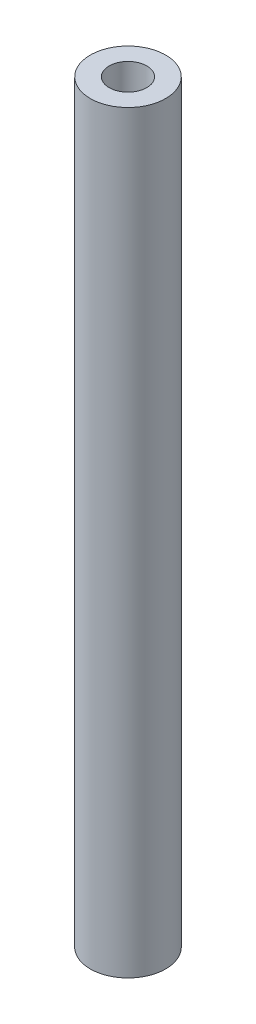
ISO-10303-21;
HEADER;
FILE_DESCRIPTION(('STEP AP214'),'2;1');
FILE_NAME('part.step','',(''),(''),'','','');
FILE_SCHEMA(('AUTOMOTIVE_DESIGN { 1 0 10303 214 1 1 1 1 }'));
ENDSEC;
DATA;
#1=APPLICATION_CONTEXT('core data for automotive mechanical design processes');
#2=APPLICATION_PROTOCOL_DEFINITION('international standard','automotive_design',2000,#1);
#3=PRODUCT_CONTEXT('',#1,'mechanical');
#4=PRODUCT('Part','Part','',(#3));
#5=PRODUCT_RELATED_PRODUCT_CATEGORY('part','',(#4));
#6=PRODUCT_DEFINITION_FORMATION('','',#4);
#7=PRODUCT_DEFINITION_CONTEXT('part definition',#1,'design');
#8=PRODUCT_DEFINITION('design','',#6,#7);
#9=PRODUCT_DEFINITION_SHAPE('','',#8);
#10=(LENGTH_UNIT() NAMED_UNIT(*) SI_UNIT(.MILLI.,.METRE.));
#11=(NAMED_UNIT(*) PLANE_ANGLE_UNIT() SI_UNIT($,.RADIAN.));
#12=(NAMED_UNIT(*) SI_UNIT($,.STERADIAN.) SOLID_ANGLE_UNIT());
#13=UNCERTAINTY_MEASURE_WITH_UNIT(LENGTH_MEASURE(1.E-05),#10,'distance_accuracy_value','');
#14=(GEOMETRIC_REPRESENTATION_CONTEXT(3) GLOBAL_UNCERTAINTY_ASSIGNED_CONTEXT((#13)) GLOBAL_UNIT_ASSIGNED_CONTEXT((#10,
#11,#12)) REPRESENTATION_CONTEXT('',''));
#15=CARTESIAN_POINT('',(0.,0.,0.));
#16=DIRECTION('',(0.,0.,1.));
#17=DIRECTION('',(1.,0.,0.));
#18=AXIS2_PLACEMENT_3D('',#15,#16,#17);
#19=CARTESIAN_POINT('',(0.,80.,0.));
#20=DIRECTION('',(0.,1.,0.));
#21=DIRECTION('',(0.,0.,1.));
#22=AXIS2_PLACEMENT_3D('',#19,#20,#21);
#23=PLANE('',#22);
#24=CARTESIAN_POINT('',(0.,80.,0.));
#25=DIRECTION('',(0.,1.,0.));
#26=DIRECTION('',(0.,0.,1.));
#27=AXIS2_PLACEMENT_3D('',#24,#25,#26);
#28=CIRCLE('',#27,4.);
#29=CARTESIAN_POINT('',(0.,80.,4.));
#30=VERTEX_POINT('',#29);
#31=EDGE_CURVE('E10',#30,#30,#28,.T.);
#32=ORIENTED_EDGE('',*,*,#31,.T.);
#33=EDGE_LOOP('',(#32));
#34=FACE_BOUND('',#33,.T.);
#35=CARTESIAN_POINT('',(0.,80.,0.));
#36=DIRECTION('',(0.,1.,0.));
#37=DIRECTION('',(0.,0.,1.));
#38=AXIS2_PLACEMENT_3D('',#35,#36,#37);
#39=CIRCLE('',#38,2.);
#40=CARTESIAN_POINT('',(0.,80.,2.));
#41=VERTEX_POINT('',#40);
#42=EDGE_CURVE('E48',#41,#41,#39,.T.);
#43=ORIENTED_EDGE('',*,*,#42,.F.);
#44=EDGE_LOOP('',(#43));
#45=FACE_BOUND('',#44,.T.);
#46=ADVANCED_FACE('F37',(#34,#45),#23,.T.);
#47=CARTESIAN_POINT('',(0.,0.,0.));
#48=DIRECTION('',(0.,1.,0.));
#49=DIRECTION('',(0.,0.,1.));
#50=AXIS2_PLACEMENT_3D('',#47,#48,#49);
#51=PLANE('',#50);
#52=CARTESIAN_POINT('',(0.,0.,0.));
#53=DIRECTION('',(0.,1.,0.));
#54=DIRECTION('',(0.,0.,1.));
#55=AXIS2_PLACEMENT_3D('',#52,#53,#54);
#56=CIRCLE('',#55,4.);
#57=CARTESIAN_POINT('',(0.,0.,4.));
#58=VERTEX_POINT('',#57);
#59=EDGE_CURVE('E41',#58,#58,#56,.T.);
#60=ORIENTED_EDGE('',*,*,#59,.F.);
#61=EDGE_LOOP('',(#60));
#62=FACE_BOUND('',#61,.T.);
#63=CARTESIAN_POINT('',(0.,0.,0.));
#64=DIRECTION('',(0.,1.,0.));
#65=DIRECTION('',(0.,0.,1.));
#66=AXIS2_PLACEMENT_3D('',#63,#64,#65);
#67=CIRCLE('',#66,2.);
#68=CARTESIAN_POINT('',(0.,0.,2.));
#69=VERTEX_POINT('',#68);
#70=EDGE_CURVE('E50',#69,#69,#67,.T.);
#71=ORIENTED_EDGE('',*,*,#70,.T.);
#72=EDGE_LOOP('',(#71));
#73=FACE_BOUND('',#72,.T.);
#74=ADVANCED_FACE('F60',(#62,#73),#51,.F.);
#75=CARTESIAN_POINT('',(0.,80.,0.));
#76=DIRECTION('',(0.,-1.,0.));
#77=DIRECTION('',(0.,0.,-1.));
#78=AXIS2_PLACEMENT_3D('',#75,#76,#77);
#79=CYLINDRICAL_SURFACE('',#78,4.);
#80=ORIENTED_EDGE('',*,*,#31,.F.);
#81=EDGE_LOOP('',(#80));
#82=FACE_BOUND('',#81,.T.);
#83=ORIENTED_EDGE('',*,*,#59,.T.);
#84=EDGE_LOOP('',(#83));
#85=FACE_BOUND('',#84,.T.);
#86=ADVANCED_FACE('F39',(#82,#85),#79,.T.);
#87=CARTESIAN_POINT('',(0.,80.,0.));
#88=DIRECTION('',(0.,-1.,0.));
#89=DIRECTION('',(0.,0.,-1.));
#90=AXIS2_PLACEMENT_3D('',#87,#88,#89);
#91=CYLINDRICAL_SURFACE('',#90,2.);
#92=ORIENTED_EDGE('',*,*,#42,.T.);
#93=EDGE_LOOP('',(#92));
#94=FACE_BOUND('',#93,.T.);
#95=ORIENTED_EDGE('',*,*,#70,.F.);
#96=EDGE_LOOP('',(#95));
#97=FACE_BOUND('',#96,.T.);
#98=ADVANCED_FACE('F56',(#94,#97),#91,.F.);
#99=CLOSED_SHELL('',(#46,#74,#86,#98));
#100=MANIFOLD_SOLID_BREP('B2',#99);
#101=ADVANCED_BREP_SHAPE_REPRESENTATION('',(#18,#100),#14);
#102=SHAPE_DEFINITION_REPRESENTATION(#9,#101);
ENDSEC;
END-ISO-10303-21;
